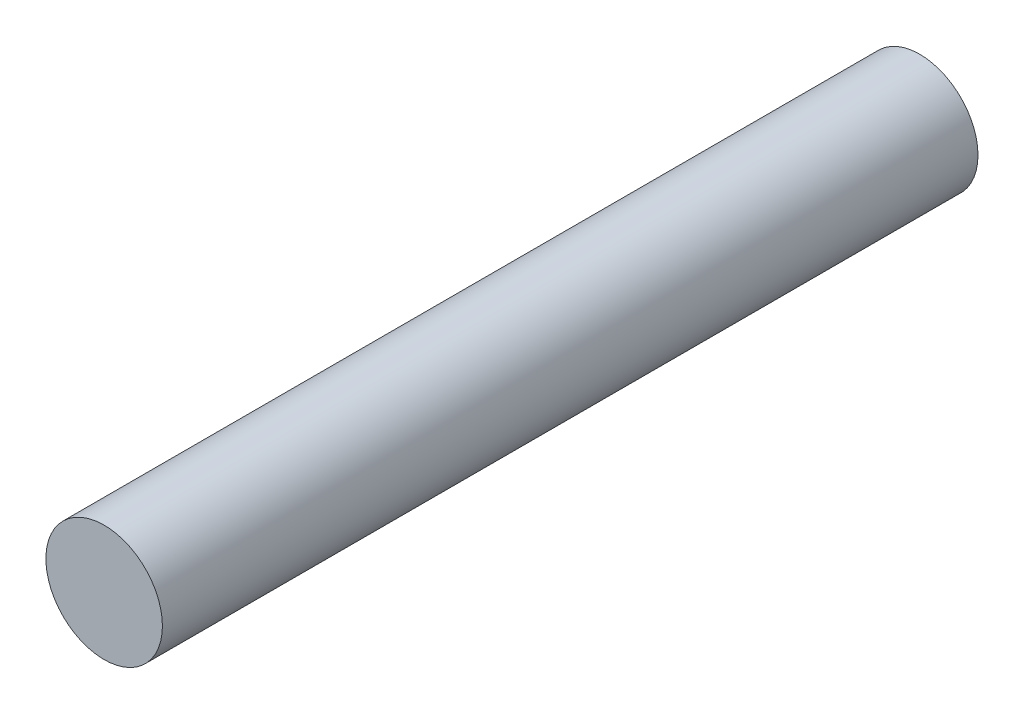
ISO-10303-21;
HEADER;
FILE_DESCRIPTION(('STEP AP214'),'2;1');
FILE_NAME('part.step','',(''),(''),'','','');
FILE_SCHEMA(('AUTOMOTIVE_DESIGN { 1 0 10303 214 1 1 1 1 }'));
ENDSEC;
DATA;
#1=APPLICATION_CONTEXT('core data for automotive mechanical design processes');
#2=APPLICATION_PROTOCOL_DEFINITION('international standard','automotive_design',2000,#1);
#3=PRODUCT_CONTEXT('',#1,'mechanical');
#4=PRODUCT('Part','Part','',(#3));
#5=PRODUCT_RELATED_PRODUCT_CATEGORY('part','',(#4));
#6=PRODUCT_DEFINITION_FORMATION('','',#4);
#7=PRODUCT_DEFINITION_CONTEXT('part definition',#1,'design');
#8=PRODUCT_DEFINITION('design','',#6,#7);
#9=PRODUCT_DEFINITION_SHAPE('','',#8);
#10=(LENGTH_UNIT() NAMED_UNIT(*) SI_UNIT(.MILLI.,.METRE.));
#11=(NAMED_UNIT(*) PLANE_ANGLE_UNIT() SI_UNIT($,.RADIAN.));
#12=(NAMED_UNIT(*) SI_UNIT($,.STERADIAN.) SOLID_ANGLE_UNIT());
#13=UNCERTAINTY_MEASURE_WITH_UNIT(LENGTH_MEASURE(1.E-05),#10,'distance_accuracy_value','');
#14=(GEOMETRIC_REPRESENTATION_CONTEXT(3) GLOBAL_UNCERTAINTY_ASSIGNED_CONTEXT((#13)) GLOBAL_UNIT_ASSIGNED_CONTEXT((#10,
#11,#12)) REPRESENTATION_CONTEXT('',''));
#15=CARTESIAN_POINT('',(0.,0.,0.));
#16=DIRECTION('',(0.,0.,1.));
#17=DIRECTION('',(1.,0.,0.));
#18=AXIS2_PLACEMENT_3D('',#15,#16,#17);
#19=CARTESIAN_POINT('',(0.,0.,7.));
#20=DIRECTION('',(0.,0.,-1.));
#21=DIRECTION('',(-1.,0.,0.));
#22=AXIS2_PLACEMENT_3D('',#19,#20,#21);
#23=CYLINDRICAL_SURFACE('',#22,1.);
#24=CARTESIAN_POINT('',(0.,0.,7.));
#25=DIRECTION('',(0.,0.,1.));
#26=DIRECTION('',(1.,0.,0.));
#27=AXIS2_PLACEMENT_3D('',#24,#25,#26);
#28=CIRCLE('',#27,1.);
#29=CARTESIAN_POINT('',(1.,0.,7.));
#30=VERTEX_POINT('',#29);
#31=EDGE_CURVE('E10',#30,#30,#28,.T.);
#32=ORIENTED_EDGE('',*,*,#31,.F.);
#33=EDGE_LOOP('',(#32));
#34=FACE_BOUND('',#33,.T.);
#35=CARTESIAN_POINT('',(0.,0.,-7.));
#36=DIRECTION('',(0.,0.,1.));
#37=DIRECTION('',(1.,0.,0.));
#38=AXIS2_PLACEMENT_3D('',#35,#36,#37);
#39=CIRCLE('',#38,1.);
#40=CARTESIAN_POINT('',(1.,0.,-7.));
#41=VERTEX_POINT('',#40);
#42=EDGE_CURVE('E38',#41,#41,#39,.T.);
#43=ORIENTED_EDGE('',*,*,#42,.T.);
#44=EDGE_LOOP('',(#43));
#45=FACE_BOUND('',#44,.T.);
#46=ADVANCED_FACE('F35',(#34,#45),#23,.T.);
#47=CARTESIAN_POINT('',(0.,0.,7.));
#48=DIRECTION('',(0.,0.,1.));
#49=DIRECTION('',(1.,0.,0.));
#50=AXIS2_PLACEMENT_3D('',#47,#48,#49);
#51=PLANE('',#50);
#52=ORIENTED_EDGE('',*,*,#31,.T.);
#53=EDGE_LOOP('',(#52));
#54=FACE_BOUND('',#53,.T.);
#55=ADVANCED_FACE('F50',(#54),#51,.T.);
#56=CARTESIAN_POINT('',(0.,0.,-7.));
#57=DIRECTION('',(0.,0.,1.));
#58=DIRECTION('',(1.,0.,0.));
#59=AXIS2_PLACEMENT_3D('',#56,#57,#58);
#60=PLANE('',#59);
#61=ORIENTED_EDGE('',*,*,#42,.F.);
#62=EDGE_LOOP('',(#61));
#63=FACE_BOUND('',#62,.T.);
#64=ADVANCED_FACE('F48',(#63),#60,.F.);
#65=CLOSED_SHELL('',(#46,#55,#64));
#66=MANIFOLD_SOLID_BREP('B2',#65);
#67=ADVANCED_BREP_SHAPE_REPRESENTATION('',(#18,#66),#14);
#68=SHAPE_DEFINITION_REPRESENTATION(#9,#67);
ENDSEC;
END-ISO-10303-21;
